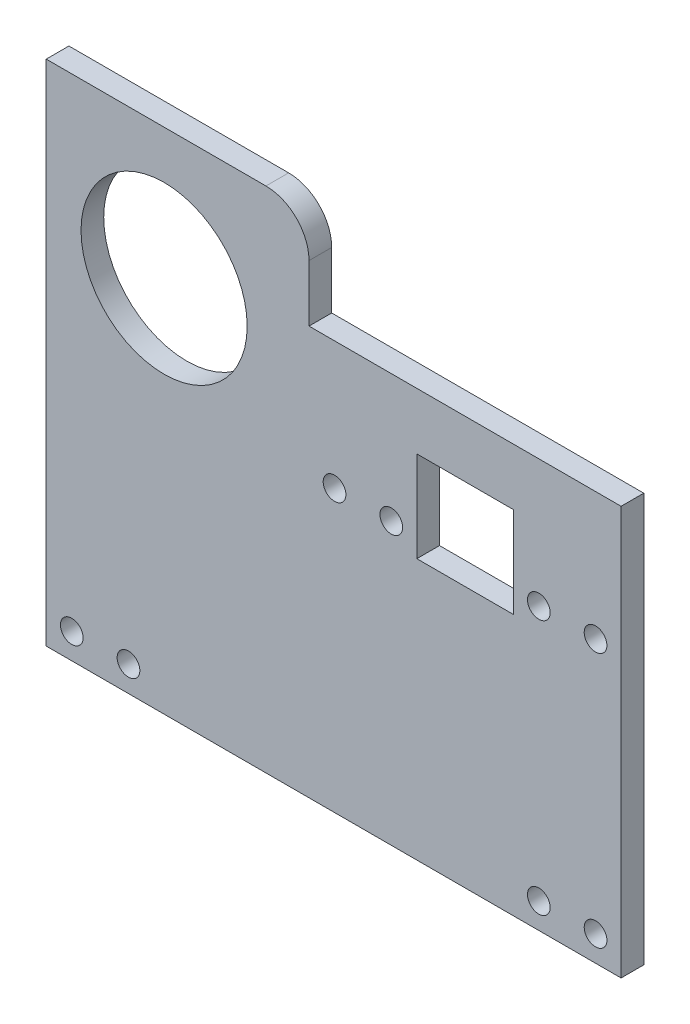
ISO-10303-21;
HEADER;
FILE_DESCRIPTION(('STEP AP214'),'2;1');
FILE_NAME('part.step','',(''),(''),'','','');
FILE_SCHEMA(('AUTOMOTIVE_DESIGN { 1 0 10303 214 1 1 1 1 }'));
ENDSEC;
DATA;
#1=APPLICATION_CONTEXT('core data for automotive mechanical design processes');
#2=APPLICATION_PROTOCOL_DEFINITION('international standard','automotive_design',2000,#1);
#3=PRODUCT_CONTEXT('',#1,'mechanical');
#4=PRODUCT('Part','Part','',(#3));
#5=PRODUCT_RELATED_PRODUCT_CATEGORY('part','',(#4));
#6=PRODUCT_DEFINITION_FORMATION('','',#4);
#7=PRODUCT_DEFINITION_CONTEXT('part definition',#1,'design');
#8=PRODUCT_DEFINITION('design','',#6,#7);
#9=PRODUCT_DEFINITION_SHAPE('','',#8);
#10=(LENGTH_UNIT() NAMED_UNIT(*) SI_UNIT(.MILLI.,.METRE.));
#11=(NAMED_UNIT(*) PLANE_ANGLE_UNIT() SI_UNIT($,.RADIAN.));
#12=(NAMED_UNIT(*) SI_UNIT($,.STERADIAN.) SOLID_ANGLE_UNIT());
#13=UNCERTAINTY_MEASURE_WITH_UNIT(LENGTH_MEASURE(1.E-05),#10,'distance_accuracy_value','');
#14=(GEOMETRIC_REPRESENTATION_CONTEXT(3) GLOBAL_UNCERTAINTY_ASSIGNED_CONTEXT((#13)) GLOBAL_UNIT_ASSIGNED_CONTEXT((#10,
#11,#12)) REPRESENTATION_CONTEXT('',''));
#15=CARTESIAN_POINT('',(0.,0.,0.));
#16=DIRECTION('',(0.,0.,1.));
#17=DIRECTION('',(1.,0.,0.));
#18=AXIS2_PLACEMENT_3D('',#15,#16,#17);
#19=CARTESIAN_POINT('',(-16.5385577934033,-32.1936087650218,4.));
#20=DIRECTION('',(0.,0.,1.));
#21=DIRECTION('',(1.,0.,0.));
#22=AXIS2_PLACEMENT_3D('',#19,#20,#21);
#23=PLANE('',#22);
#24=DIRECTION('',(0.,-1.,0.));
#25=VECTOR('',#24,1.);
#26=CARTESIAN_POINT('',(10.0534872735402,-52.1936087650218,4.));
#27=LINE('',#26,#25);
#28=CARTESIAN_POINT('',(10.0534872735402,-52.1936087650218,4.));
#29=VERTEX_POINT('',#28);
#30=CARTESIAN_POINT('',(10.0534872735403,-68.1936087650218,4.));
#31=VERTEX_POINT('',#30);
#32=EDGE_CURVE('E50',#29,#31,#27,.T.);
#33=ORIENTED_EDGE('',*,*,#32,.F.);
#34=DIRECTION('',(-1.,0.,0.));
#35=VECTOR('',#34,1.);
#36=CARTESIAN_POINT('',(10.0534872735402,-52.1936087650218,4.));
#37=LINE('',#36,#35);
#38=CARTESIAN_POINT('',(27.0534872735403,-52.1936087650218,4.));
#39=VERTEX_POINT('',#38);
#40=EDGE_CURVE('E136',#39,#29,#37,.T.);
#41=ORIENTED_EDGE('',*,*,#40,.F.);
#42=DIRECTION('',(0.,1.,0.));
#43=VECTOR('',#42,1.);
#44=CARTESIAN_POINT('',(27.0534872735403,-52.1936087650218,4.));
#45=LINE('',#44,#43);
#46=CARTESIAN_POINT('',(27.0534872735403,-68.1936087650218,4.));
#47=VERTEX_POINT('',#46);
#48=EDGE_CURVE('E121',#47,#39,#45,.T.);
#49=ORIENTED_EDGE('',*,*,#48,.F.);
#50=DIRECTION('',(1.,0.,0.));
#51=VECTOR('',#50,1.);
#52=CARTESIAN_POINT('',(10.0534872735403,-68.1936087650218,4.));
#53=LINE('',#52,#51);
#54=EDGE_CURVE('E130',#31,#47,#53,.T.);
#55=ORIENTED_EDGE('',*,*,#54,.F.);
#56=EDGE_LOOP('',(#33,#41,#49,#55));
#57=FACE_BOUND('',#56,.T.);
#58=CARTESIAN_POINT('',(31.5534872735402,-109.693608765022,4.));
#59=DIRECTION('',(0.,0.,1.));
#60=DIRECTION('',(1.,0.,0.));
#61=AXIS2_PLACEMENT_3D('',#58,#59,#60);
#62=CIRCLE('',#61,2.);
#63=CARTESIAN_POINT('',(33.5534872735402,-109.693608765022,4.));
#64=VERTEX_POINT('',#63);
#65=EDGE_CURVE('E146',#64,#64,#62,.T.);
#66=ORIENTED_EDGE('',*,*,#65,.F.);
#67=EDGE_LOOP('',(#66));
#68=FACE_BOUND('',#67,.T.);
#69=CARTESIAN_POINT('',(-50.7631628934033,-109.693608765022,4.));
#70=DIRECTION('',(0.,0.,1.));
#71=DIRECTION('',(1.,0.,0.));
#72=AXIS2_PLACEMENT_3D('',#69,#70,#71);
#73=CIRCLE('',#72,2.);
#74=CARTESIAN_POINT('',(-48.7631628934033,-109.693608765022,4.));
#75=VERTEX_POINT('',#74);
#76=EDGE_CURVE('E150',#75,#75,#73,.T.);
#77=ORIENTED_EDGE('',*,*,#76,.F.);
#78=EDGE_LOOP('',(#77));
#79=FACE_BOUND('',#78,.T.);
#80=CARTESIAN_POINT('',(-40.7631628934033,-109.693608765022,4.));
#81=DIRECTION('',(0.,0.,1.));
#82=DIRECTION('',(1.,0.,0.));
#83=AXIS2_PLACEMENT_3D('',#80,#81,#82);
#84=CIRCLE('',#83,2.);
#85=CARTESIAN_POINT('',(-38.7631628934033,-109.693608765022,4.));
#86=VERTEX_POINT('',#85);
#87=EDGE_CURVE('E153',#86,#86,#84,.T.);
#88=ORIENTED_EDGE('',*,*,#87,.F.);
#89=EDGE_LOOP('',(#88));
#90=FACE_BOUND('',#89,.T.);
#91=CARTESIAN_POINT('',(41.5534872735402,-64.6936087650218,4.));
#92=DIRECTION('',(0.,0.,1.));
#93=DIRECTION('',(1.,0.,0.));
#94=AXIS2_PLACEMENT_3D('',#91,#92,#93);
#95=CIRCLE('',#94,2.);
#96=CARTESIAN_POINT('',(43.5534872735402,-64.6936087650218,4.));
#97=VERTEX_POINT('',#96);
#98=EDGE_CURVE('E156',#97,#97,#95,.T.);
#99=ORIENTED_EDGE('',*,*,#98,.F.);
#100=EDGE_LOOP('',(#99));
#101=FACE_BOUND('',#100,.T.);
#102=CARTESIAN_POINT('',(31.5534872735402,-64.6936087650218,4.));
#103=DIRECTION('',(0.,0.,1.));
#104=DIRECTION('',(1.,0.,0.));
#105=AXIS2_PLACEMENT_3D('',#102,#103,#104);
#106=CIRCLE('',#105,2.);
#107=CARTESIAN_POINT('',(33.5534872735402,-64.6936087650218,4.));
#108=VERTEX_POINT('',#107);
#109=EDGE_CURVE('E159',#108,#108,#106,.T.);
#110=ORIENTED_EDGE('',*,*,#109,.F.);
#111=EDGE_LOOP('',(#110));
#112=FACE_BOUND('',#111,.T.);
#113=CARTESIAN_POINT('',(-4.44651272645975,-64.6936087650218,4.));
#114=DIRECTION('',(0.,0.,1.));
#115=DIRECTION('',(1.,0.,0.));
#116=AXIS2_PLACEMENT_3D('',#113,#114,#115);
#117=CIRCLE('',#116,2.);
#118=CARTESIAN_POINT('',(-2.44651272645975,-64.6936087650218,4.));
#119=VERTEX_POINT('',#118);
#120=EDGE_CURVE('E162',#119,#119,#117,.T.);
#121=ORIENTED_EDGE('',*,*,#120,.F.);
#122=EDGE_LOOP('',(#121));
#123=FACE_BOUND('',#122,.T.);
#124=CARTESIAN_POINT('',(5.55348727354025,-64.6936087650218,4.));
#125=DIRECTION('',(0.,0.,1.));
#126=DIRECTION('',(1.,0.,0.));
#127=AXIS2_PLACEMENT_3D('',#124,#125,#126);
#128=CIRCLE('',#127,2.);
#129=CARTESIAN_POINT('',(7.55348727354025,-64.6936087650218,4.));
#130=VERTEX_POINT('',#129);
#131=EDGE_CURVE('E143',#130,#130,#128,.T.);
#132=ORIENTED_EDGE('',*,*,#131,.F.);
#133=EDGE_LOOP('',(#132));
#134=FACE_BOUND('',#133,.T.);
#135=CARTESIAN_POINT('',(41.5534872735402,-109.693608765022,4.));
#136=DIRECTION('',(0.,0.,1.));
#137=DIRECTION('',(1.,0.,0.));
#138=AXIS2_PLACEMENT_3D('',#135,#136,#137);
#139=CIRCLE('',#138,2.);
#140=CARTESIAN_POINT('',(43.5534872735402,-109.693608765022,4.));
#141=VERTEX_POINT('',#140);
#142=EDGE_CURVE('E167',#141,#141,#139,.T.);
#143=ORIENTED_EDGE('',*,*,#142,.F.);
#144=EDGE_LOOP('',(#143));
#145=FACE_BOUND('',#144,.T.);
#146=DIRECTION('',(0.,1.,0.));
#147=VECTOR('',#146,1.);
#148=CARTESIAN_POINT('',(-8.94651272645975,-42.1936087650218,4.));
#149=LINE('',#148,#147);
#150=CARTESIAN_POINT('',(-8.94651272645975,-42.1936087650218,4.));
#151=VERTEX_POINT('',#150);
#152=CARTESIAN_POINT('',(-8.94651272645974,-32.1936087650218,4.));
#153=VERTEX_POINT('',#152);
#154=EDGE_CURVE('E179',#151,#153,#149,.T.);
#155=ORIENTED_EDGE('',*,*,#154,.T.);
#156=CARTESIAN_POINT('',(-16.5385577934033,-32.1936087650218,4.));
#157=DIRECTION('',(0.,0.,1.));
#158=DIRECTION('',(1.,0.,0.));
#159=AXIS2_PLACEMENT_3D('',#156,#157,#158);
#160=CIRCLE('',#159,7.59204506694357);
#161=CARTESIAN_POINT('',(-16.5385577934033,-24.6015636980782,4.));
#162=VERTEX_POINT('',#161);
#163=EDGE_CURVE('E182',#153,#162,#160,.T.);
#164=ORIENTED_EDGE('',*,*,#163,.T.);
#165=DIRECTION('',(-1.,0.,0.));
#166=VECTOR('',#165,1.);
#167=CARTESIAN_POINT('',(-16.5385577934033,-24.6015636980782,4.));
#168=LINE('',#167,#166);
#169=CARTESIAN_POINT('',(-55.2631628934033,-24.6015636980782,4.));
#170=VERTEX_POINT('',#169);
#171=EDGE_CURVE('E185',#162,#170,#168,.T.);
#172=ORIENTED_EDGE('',*,*,#171,.T.);
#173=DIRECTION('',(0.,-1.,0.));
#174=VECTOR('',#173,1.);
#175=CARTESIAN_POINT('',(-55.2631628934033,-24.6015636980782,4.));
#176=LINE('',#175,#174);
#177=CARTESIAN_POINT('',(-55.2631628934033,-114.193608765022,4.));
#178=VERTEX_POINT('',#177);
#179=EDGE_CURVE('E187',#170,#178,#176,.T.);
#180=ORIENTED_EDGE('',*,*,#179,.T.);
#181=DIRECTION('',(1.,0.,0.));
#182=VECTOR('',#181,1.);
#183=CARTESIAN_POINT('',(46.0534872735402,-114.193608765022,4.));
#184=LINE('',#183,#182);
#185=CARTESIAN_POINT('',(46.0534872735402,-114.193608765022,4.));
#186=VERTEX_POINT('',#185);
#187=EDGE_CURVE('E189',#178,#186,#184,.T.);
#188=ORIENTED_EDGE('',*,*,#187,.T.);
#189=DIRECTION('',(0.,1.,0.));
#190=VECTOR('',#189,1.);
#191=CARTESIAN_POINT('',(46.0534872735402,-42.1936087650218,4.));
#192=LINE('',#191,#190);
#193=CARTESIAN_POINT('',(46.0534872735402,-42.1936087650218,4.));
#194=VERTEX_POINT('',#193);
#195=EDGE_CURVE('E191',#186,#194,#192,.T.);
#196=ORIENTED_EDGE('',*,*,#195,.T.);
#197=DIRECTION('',(-1.,0.,0.));
#198=VECTOR('',#197,1.);
#199=CARTESIAN_POINT('',(-8.94651272645975,-42.1936087650218,4.));
#200=LINE('',#199,#198);
#201=EDGE_CURVE('E193',#194,#151,#200,.T.);
#202=ORIENTED_EDGE('',*,*,#201,.T.);
#203=EDGE_LOOP('',(#155,#164,#172,#180,#188,#196,#202));
#204=FACE_BOUND('',#203,.T.);
#205=CARTESIAN_POINT('',(-34.4865127264598,-47.6715636980782,4.));
#206=DIRECTION('',(0.,0.,1.));
#207=DIRECTION('',(1.,0.,0.));
#208=AXIS2_PLACEMENT_3D('',#205,#206,#207);
#209=CIRCLE('',#208,14.6418012005341);
#210=CARTESIAN_POINT('',(-19.8447115259257,-47.6715636980782,4.));
#211=VERTEX_POINT('',#210);
#212=EDGE_CURVE('E172',#211,#211,#209,.T.);
#213=ORIENTED_EDGE('',*,*,#212,.F.);
#214=EDGE_LOOP('',(#213));
#215=FACE_BOUND('',#214,.T.);
#216=ADVANCED_FACE('F35',(#57,#68,#79,#90,#101,#112,#123,#134,#145,#204,#215),#23,.T.);
#217=CARTESIAN_POINT('',(-16.5385577934033,-32.1936087650218,0.));
#218=DIRECTION('',(0.,0.,1.));
#219=DIRECTION('',(1.,0.,0.));
#220=AXIS2_PLACEMENT_3D('',#217,#218,#219);
#221=PLANE('',#220);
#222=DIRECTION('',(-1.,0.,0.));
#223=VECTOR('',#222,1.);
#224=CARTESIAN_POINT('',(-16.5385577934033,-52.1936087650218,0.));
#225=LINE('',#224,#223);
#226=CARTESIAN_POINT('',(27.0534872735403,-52.1936087650218,0.));
#227=VERTEX_POINT('',#226);
#228=CARTESIAN_POINT('',(10.0534872735402,-52.1936087650218,0.));
#229=VERTEX_POINT('',#228);
#230=EDGE_CURVE('E43',#227,#229,#225,.T.);
#231=ORIENTED_EDGE('',*,*,#230,.T.);
#232=DIRECTION('',(0.,-1.,0.));
#233=VECTOR('',#232,1.);
#234=CARTESIAN_POINT('',(10.0534872735402,-32.1936087650218,0.));
#235=LINE('',#234,#233);
#236=CARTESIAN_POINT('',(10.0534872735403,-68.1936087650218,0.));
#237=VERTEX_POINT('',#236);
#238=EDGE_CURVE('E11',#229,#237,#235,.T.);
#239=ORIENTED_EDGE('',*,*,#238,.T.);
#240=DIRECTION('',(1.,0.,0.));
#241=VECTOR('',#240,1.);
#242=CARTESIAN_POINT('',(-16.5385577934033,-68.1936087650218,0.));
#243=LINE('',#242,#241);
#244=CARTESIAN_POINT('',(27.0534872735403,-68.1936087650218,0.));
#245=VERTEX_POINT('',#244);
#246=EDGE_CURVE('E229',#237,#245,#243,.T.);
#247=ORIENTED_EDGE('',*,*,#246,.T.);
#248=DIRECTION('',(0.,1.,0.));
#249=VECTOR('',#248,1.);
#250=CARTESIAN_POINT('',(27.0534872735402,-32.1936087650218,0.));
#251=LINE('',#250,#249);
#252=EDGE_CURVE('E124',#245,#227,#251,.T.);
#253=ORIENTED_EDGE('',*,*,#252,.T.);
#254=EDGE_LOOP('',(#231,#239,#247,#253));
#255=FACE_BOUND('',#254,.T.);
#256=CARTESIAN_POINT('',(31.5534872735402,-109.693608765022,0.));
#257=DIRECTION('',(0.,0.,1.));
#258=DIRECTION('',(1.,0.,0.));
#259=AXIS2_PLACEMENT_3D('',#256,#257,#258);
#260=CIRCLE('',#259,2.);
#261=CARTESIAN_POINT('',(33.5534872735402,-109.693608765022,0.));
#262=VERTEX_POINT('',#261);
#263=EDGE_CURVE('E171',#262,#262,#260,.T.);
#264=ORIENTED_EDGE('',*,*,#263,.T.);
#265=EDGE_LOOP('',(#264));
#266=FACE_BOUND('',#265,.T.);
#267=CARTESIAN_POINT('',(-50.7631628934033,-109.693608765022,0.));
#268=DIRECTION('',(0.,0.,1.));
#269=DIRECTION('',(1.,0.,0.));
#270=AXIS2_PLACEMENT_3D('',#267,#268,#269);
#271=CIRCLE('',#270,2.);
#272=CARTESIAN_POINT('',(-48.7631628934033,-109.693608765022,0.));
#273=VERTEX_POINT('',#272);
#274=EDGE_CURVE('E246',#273,#273,#271,.T.);
#275=ORIENTED_EDGE('',*,*,#274,.T.);
#276=EDGE_LOOP('',(#275));
#277=FACE_BOUND('',#276,.T.);
#278=CARTESIAN_POINT('',(-40.7631628934033,-109.693608765022,0.));
#279=DIRECTION('',(0.,0.,1.));
#280=DIRECTION('',(1.,0.,0.));
#281=AXIS2_PLACEMENT_3D('',#278,#279,#280);
#282=CIRCLE('',#281,2.);
#283=CARTESIAN_POINT('',(-38.7631628934033,-109.693608765022,0.));
#284=VERTEX_POINT('',#283);
#285=EDGE_CURVE('E243',#284,#284,#282,.T.);
#286=ORIENTED_EDGE('',*,*,#285,.T.);
#287=EDGE_LOOP('',(#286));
#288=FACE_BOUND('',#287,.T.);
#289=CARTESIAN_POINT('',(41.5534872735402,-64.6936087650218,0.));
#290=DIRECTION('',(0.,0.,1.));
#291=DIRECTION('',(1.,0.,0.));
#292=AXIS2_PLACEMENT_3D('',#289,#290,#291);
#293=CIRCLE('',#292,2.);
#294=CARTESIAN_POINT('',(43.5534872735402,-64.6936087650218,0.));
#295=VERTEX_POINT('',#294);
#296=EDGE_CURVE('E240',#295,#295,#293,.T.);
#297=ORIENTED_EDGE('',*,*,#296,.T.);
#298=EDGE_LOOP('',(#297));
#299=FACE_BOUND('',#298,.T.);
#300=CARTESIAN_POINT('',(31.5534872735402,-64.6936087650218,0.));
#301=DIRECTION('',(0.,0.,1.));
#302=DIRECTION('',(1.,0.,0.));
#303=AXIS2_PLACEMENT_3D('',#300,#301,#302);
#304=CIRCLE('',#303,2.);
#305=CARTESIAN_POINT('',(33.5534872735402,-64.6936087650218,0.));
#306=VERTEX_POINT('',#305);
#307=EDGE_CURVE('E237',#306,#306,#304,.T.);
#308=ORIENTED_EDGE('',*,*,#307,.T.);
#309=EDGE_LOOP('',(#308));
#310=FACE_BOUND('',#309,.T.);
#311=CARTESIAN_POINT('',(-4.44651272645975,-64.6936087650218,0.));
#312=DIRECTION('',(0.,0.,1.));
#313=DIRECTION('',(1.,0.,0.));
#314=AXIS2_PLACEMENT_3D('',#311,#312,#313);
#315=CIRCLE('',#314,2.);
#316=CARTESIAN_POINT('',(-2.44651272645975,-64.6936087650218,0.));
#317=VERTEX_POINT('',#316);
#318=EDGE_CURVE('E234',#317,#317,#315,.T.);
#319=ORIENTED_EDGE('',*,*,#318,.T.);
#320=EDGE_LOOP('',(#319));
#321=FACE_BOUND('',#320,.T.);
#322=CARTESIAN_POINT('',(5.55348727354025,-64.6936087650218,0.));
#323=DIRECTION('',(0.,0.,1.));
#324=DIRECTION('',(1.,0.,0.));
#325=AXIS2_PLACEMENT_3D('',#322,#323,#324);
#326=CIRCLE('',#325,2.);
#327=CARTESIAN_POINT('',(7.55348727354025,-64.6936087650218,0.));
#328=VERTEX_POINT('',#327);
#329=EDGE_CURVE('E149',#328,#328,#326,.T.);
#330=ORIENTED_EDGE('',*,*,#329,.T.);
#331=EDGE_LOOP('',(#330));
#332=FACE_BOUND('',#331,.T.);
#333=CARTESIAN_POINT('',(41.5534872735402,-109.693608765022,0.));
#334=DIRECTION('',(0.,0.,1.));
#335=DIRECTION('',(1.,0.,0.));
#336=AXIS2_PLACEMENT_3D('',#333,#334,#335);
#337=CIRCLE('',#336,2.);
#338=CARTESIAN_POINT('',(43.5534872735402,-109.693608765022,0.));
#339=VERTEX_POINT('',#338);
#340=EDGE_CURVE('E170',#339,#339,#337,.T.);
#341=ORIENTED_EDGE('',*,*,#340,.T.);
#342=EDGE_LOOP('',(#341));
#343=FACE_BOUND('',#342,.T.);
#344=DIRECTION('',(0.,1.,0.));
#345=VECTOR('',#344,1.);
#346=CARTESIAN_POINT('',(-8.94651272645975,-42.1936087650218,0.));
#347=LINE('',#346,#345);
#348=CARTESIAN_POINT('',(-8.94651272645975,-42.1936087650218,0.));
#349=VERTEX_POINT('',#348);
#350=CARTESIAN_POINT('',(-8.94651272645974,-32.1936087650218,0.));
#351=VERTEX_POINT('',#350);
#352=EDGE_CURVE('E175',#349,#351,#347,.T.);
#353=ORIENTED_EDGE('',*,*,#352,.F.);
#354=DIRECTION('',(-1.,0.,0.));
#355=VECTOR('',#354,1.);
#356=CARTESIAN_POINT('',(-8.94651272645975,-42.1936087650218,0.));
#357=LINE('',#356,#355);
#358=CARTESIAN_POINT('',(46.0534872735402,-42.1936087650218,0.));
#359=VERTEX_POINT('',#358);
#360=EDGE_CURVE('E183',#359,#349,#357,.T.);
#361=ORIENTED_EDGE('',*,*,#360,.F.);
#362=DIRECTION('',(0.,1.,0.));
#363=VECTOR('',#362,1.);
#364=CARTESIAN_POINT('',(46.0534872735402,-42.1936087650218,0.));
#365=LINE('',#364,#363);
#366=CARTESIAN_POINT('',(46.0534872735402,-114.193608765022,0.));
#367=VERTEX_POINT('',#366);
#368=EDGE_CURVE('E206',#367,#359,#365,.T.);
#369=ORIENTED_EDGE('',*,*,#368,.F.);
#370=DIRECTION('',(1.,0.,0.));
#371=VECTOR('',#370,1.);
#372=CARTESIAN_POINT('',(46.0534872735402,-114.193608765022,0.));
#373=LINE('',#372,#371);
#374=CARTESIAN_POINT('',(-55.2631628934033,-114.193608765022,0.));
#375=VERTEX_POINT('',#374);
#376=EDGE_CURVE('E204',#375,#367,#373,.T.);
#377=ORIENTED_EDGE('',*,*,#376,.F.);
#378=DIRECTION('',(0.,-1.,0.));
#379=VECTOR('',#378,1.);
#380=CARTESIAN_POINT('',(-55.2631628934033,-24.6015636980782,0.));
#381=LINE('',#380,#379);
#382=CARTESIAN_POINT('',(-55.2631628934033,-24.6015636980782,0.));
#383=VERTEX_POINT('',#382);
#384=EDGE_CURVE('E202',#383,#375,#381,.T.);
#385=ORIENTED_EDGE('',*,*,#384,.F.);
#386=DIRECTION('',(-1.,0.,0.));
#387=VECTOR('',#386,1.);
#388=CARTESIAN_POINT('',(-16.5385577934033,-24.6015636980782,0.));
#389=LINE('',#388,#387);
#390=CARTESIAN_POINT('',(-16.5385577934033,-24.6015636980782,0.));
#391=VERTEX_POINT('',#390);
#392=EDGE_CURVE('E200',#391,#383,#389,.T.);
#393=ORIENTED_EDGE('',*,*,#392,.F.);
#394=CARTESIAN_POINT('',(-16.5385577934033,-32.1936087650218,0.));
#395=DIRECTION('',(0.,0.,1.));
#396=DIRECTION('',(1.,0.,0.));
#397=AXIS2_PLACEMENT_3D('',#394,#395,#396);
#398=CIRCLE('',#397,7.59204506694357);
#399=EDGE_CURVE('E198',#351,#391,#398,.T.);
#400=ORIENTED_EDGE('',*,*,#399,.F.);
#401=EDGE_LOOP('',(#353,#361,#369,#377,#385,#393,#400));
#402=FACE_BOUND('',#401,.T.);
#403=CARTESIAN_POINT('',(-34.4865127264598,-47.6715636980782,0.));
#404=DIRECTION('',(0.,0.,1.));
#405=DIRECTION('',(1.,0.,0.));
#406=AXIS2_PLACEMENT_3D('',#403,#404,#405);
#407=CIRCLE('',#406,14.6418012005341);
#408=CARTESIAN_POINT('',(-19.8447115259257,-47.6715636980782,0.));
#409=VERTEX_POINT('',#408);
#410=EDGE_CURVE('E176',#409,#409,#407,.T.);
#411=ORIENTED_EDGE('',*,*,#410,.T.);
#412=EDGE_LOOP('',(#411));
#413=FACE_BOUND('',#412,.T.);
#414=ADVANCED_FACE('F254',(#255,#266,#277,#288,#299,#310,#321,#332,#343,#402,#413),#221,.F.);
#415=CARTESIAN_POINT('',(-8.94651272645975,-42.1936087650218,4.));
#416=DIRECTION('',(-1.,0.,0.));
#417=DIRECTION('',(0.,-1.,0.));
#418=AXIS2_PLACEMENT_3D('',#415,#416,#417);
#419=PLANE('',#418);
#420=ORIENTED_EDGE('',*,*,#352,.T.);
#421=DIRECTION('',(0.,0.,-1.));
#422=VECTOR('',#421,1.);
#423=CARTESIAN_POINT('',(-8.94651272645974,-32.1936087650218,4.));
#424=LINE('',#423,#422);
#425=EDGE_CURVE('E226',#153,#351,#424,.T.);
#426=ORIENTED_EDGE('',*,*,#425,.F.);
#427=ORIENTED_EDGE('',*,*,#154,.F.);
#428=DIRECTION('',(0.,0.,-1.));
#429=VECTOR('',#428,1.);
#430=CARTESIAN_POINT('',(-8.94651272645975,-42.1936087650218,4.));
#431=LINE('',#430,#429);
#432=EDGE_CURVE('E195',#151,#349,#431,.T.);
#433=ORIENTED_EDGE('',*,*,#432,.T.);
#434=EDGE_LOOP('',(#420,#426,#427,#433));
#435=FACE_BOUND('',#434,.T.);
#436=ADVANCED_FACE('F37',(#435),#419,.F.);
#437=CARTESIAN_POINT('',(-16.5385577934033,-32.1936087650218,4.));
#438=DIRECTION('',(0.,0.,-1.));
#439=DIRECTION('',(-1.,0.,0.));
#440=AXIS2_PLACEMENT_3D('',#437,#438,#439);
#441=CYLINDRICAL_SURFACE('',#440,7.59204506694357);
#442=ORIENTED_EDGE('',*,*,#399,.T.);
#443=DIRECTION('',(0.,0.,-1.));
#444=VECTOR('',#443,1.);
#445=CARTESIAN_POINT('',(-16.5385577934033,-24.6015636980782,4.));
#446=LINE('',#445,#444);
#447=EDGE_CURVE('E223',#162,#391,#446,.T.);
#448=ORIENTED_EDGE('',*,*,#447,.F.);
#449=ORIENTED_EDGE('',*,*,#163,.F.);
#450=ORIENTED_EDGE('',*,*,#425,.T.);
#451=EDGE_LOOP('',(#442,#448,#449,#450));
#452=FACE_BOUND('',#451,.T.);
#453=ADVANCED_FACE('F300',(#452),#441,.T.);
#454=CARTESIAN_POINT('',(-16.5385577934033,-24.6015636980782,4.));
#455=DIRECTION('',(0.,-1.,0.));
#456=DIRECTION('',(0.,0.,-1.));
#457=AXIS2_PLACEMENT_3D('',#454,#455,#456);
#458=PLANE('',#457);
#459=ORIENTED_EDGE('',*,*,#392,.T.);
#460=DIRECTION('',(0.,0.,-1.));
#461=VECTOR('',#460,1.);
#462=CARTESIAN_POINT('',(-55.2631628934033,-24.6015636980782,4.));
#463=LINE('',#462,#461);
#464=EDGE_CURVE('E220',#170,#383,#463,.T.);
#465=ORIENTED_EDGE('',*,*,#464,.F.);
#466=ORIENTED_EDGE('',*,*,#171,.F.);
#467=ORIENTED_EDGE('',*,*,#447,.T.);
#468=EDGE_LOOP('',(#459,#465,#466,#467));
#469=FACE_BOUND('',#468,.T.);
#470=ADVANCED_FACE('F297',(#469),#458,.F.);
#471=CARTESIAN_POINT('',(-55.2631628934033,-24.6015636980782,4.));
#472=DIRECTION('',(1.,0.,0.));
#473=DIRECTION('',(0.,1.,0.));
#474=AXIS2_PLACEMENT_3D('',#471,#472,#473);
#475=PLANE('',#474);
#476=ORIENTED_EDGE('',*,*,#384,.T.);
#477=DIRECTION('',(0.,0.,-1.));
#478=VECTOR('',#477,1.);
#479=CARTESIAN_POINT('',(-55.2631628934033,-114.193608765022,4.));
#480=LINE('',#479,#478);
#481=EDGE_CURVE('E217',#178,#375,#480,.T.);
#482=ORIENTED_EDGE('',*,*,#481,.F.);
#483=ORIENTED_EDGE('',*,*,#179,.F.);
#484=ORIENTED_EDGE('',*,*,#464,.T.);
#485=EDGE_LOOP('',(#476,#482,#483,#484));
#486=FACE_BOUND('',#485,.T.);
#487=ADVANCED_FACE('F293',(#486),#475,.F.);
#488=CARTESIAN_POINT('',(46.0534872735402,-114.193608765022,4.));
#489=DIRECTION('',(0.,1.,0.));
#490=DIRECTION('',(0.,0.,1.));
#491=AXIS2_PLACEMENT_3D('',#488,#489,#490);
#492=PLANE('',#491);
#493=ORIENTED_EDGE('',*,*,#376,.T.);
#494=DIRECTION('',(0.,0.,-1.));
#495=VECTOR('',#494,1.);
#496=CARTESIAN_POINT('',(46.0534872735402,-114.193608765022,4.));
#497=LINE('',#496,#495);
#498=EDGE_CURVE('E214',#186,#367,#497,.T.);
#499=ORIENTED_EDGE('',*,*,#498,.F.);
#500=ORIENTED_EDGE('',*,*,#187,.F.);
#501=ORIENTED_EDGE('',*,*,#481,.T.);
#502=EDGE_LOOP('',(#493,#499,#500,#501));
#503=FACE_BOUND('',#502,.T.);
#504=ADVANCED_FACE('F289',(#503),#492,.F.);
#505=CARTESIAN_POINT('',(46.0534872735402,-42.1936087650218,4.));
#506=DIRECTION('',(-1.,0.,0.));
#507=DIRECTION('',(0.,0.,1.));
#508=AXIS2_PLACEMENT_3D('',#505,#506,#507);
#509=PLANE('',#508);
#510=ORIENTED_EDGE('',*,*,#368,.T.);
#511=DIRECTION('',(0.,0.,-1.));
#512=VECTOR('',#511,1.);
#513=CARTESIAN_POINT('',(46.0534872735402,-42.1936087650218,4.));
#514=LINE('',#513,#512);
#515=EDGE_CURVE('E211',#194,#359,#514,.T.);
#516=ORIENTED_EDGE('',*,*,#515,.F.);
#517=ORIENTED_EDGE('',*,*,#195,.F.);
#518=ORIENTED_EDGE('',*,*,#498,.T.);
#519=EDGE_LOOP('',(#510,#516,#517,#518));
#520=FACE_BOUND('',#519,.T.);
#521=ADVANCED_FACE('F285',(#520),#509,.F.);
#522=CARTESIAN_POINT('',(-8.94651272645975,-42.1936087650218,4.));
#523=DIRECTION('',(0.,-1.,0.));
#524=DIRECTION('',(1.,0.,0.));
#525=AXIS2_PLACEMENT_3D('',#522,#523,#524);
#526=PLANE('',#525);
#527=ORIENTED_EDGE('',*,*,#360,.T.);
#528=ORIENTED_EDGE('',*,*,#432,.F.);
#529=ORIENTED_EDGE('',*,*,#201,.F.);
#530=ORIENTED_EDGE('',*,*,#515,.T.);
#531=EDGE_LOOP('',(#527,#528,#529,#530));
#532=FACE_BOUND('',#531,.T.);
#533=ADVANCED_FACE('F282',(#532),#526,.F.);
#534=CARTESIAN_POINT('',(-34.4865127264598,-47.6715636980782,4.));
#535=DIRECTION('',(0.,0.,-1.));
#536=DIRECTION('',(-1.,0.,0.));
#537=AXIS2_PLACEMENT_3D('',#534,#535,#536);
#538=CYLINDRICAL_SURFACE('',#537,14.6418012005341);
#539=ORIENTED_EDGE('',*,*,#212,.T.);
#540=EDGE_LOOP('',(#539));
#541=FACE_BOUND('',#540,.T.);
#542=ORIENTED_EDGE('',*,*,#410,.F.);
#543=EDGE_LOOP('',(#542));
#544=FACE_BOUND('',#543,.T.);
#545=ADVANCED_FACE('F279',(#541,#544),#538,.F.);
#546=CARTESIAN_POINT('',(41.5534872735402,-109.693608765022,-12.));
#547=DIRECTION('',(0.,0.,1.));
#548=DIRECTION('',(1.,0.,0.));
#549=AXIS2_PLACEMENT_3D('',#546,#547,#548);
#550=CYLINDRICAL_SURFACE('',#549,2.);
#551=ORIENTED_EDGE('',*,*,#142,.T.);
#552=EDGE_LOOP('',(#551));
#553=FACE_BOUND('',#552,.T.);
#554=ORIENTED_EDGE('',*,*,#340,.F.);
#555=EDGE_LOOP('',(#554));
#556=FACE_BOUND('',#555,.T.);
#557=ADVANCED_FACE('F335',(#553,#556),#550,.F.);
#558=CARTESIAN_POINT('',(5.55348727354025,-64.6936087650218,-12.));
#559=DIRECTION('',(0.,0.,1.));
#560=DIRECTION('',(1.,0.,0.));
#561=AXIS2_PLACEMENT_3D('',#558,#559,#560);
#562=CYLINDRICAL_SURFACE('',#561,2.);
#563=ORIENTED_EDGE('',*,*,#131,.T.);
#564=EDGE_LOOP('',(#563));
#565=FACE_BOUND('',#564,.T.);
#566=ORIENTED_EDGE('',*,*,#329,.F.);
#567=EDGE_LOOP('',(#566));
#568=FACE_BOUND('',#567,.T.);
#569=ADVANCED_FACE('F340',(#565,#568),#562,.F.);
#570=CARTESIAN_POINT('',(-4.44651272645975,-64.6936087650218,-12.));
#571=DIRECTION('',(0.,0.,1.));
#572=DIRECTION('',(1.,0.,0.));
#573=AXIS2_PLACEMENT_3D('',#570,#571,#572);
#574=CYLINDRICAL_SURFACE('',#573,2.);
#575=ORIENTED_EDGE('',*,*,#120,.T.);
#576=EDGE_LOOP('',(#575));
#577=FACE_BOUND('',#576,.T.);
#578=ORIENTED_EDGE('',*,*,#318,.F.);
#579=EDGE_LOOP('',(#578));
#580=FACE_BOUND('',#579,.T.);
#581=ADVANCED_FACE('F345',(#577,#580),#574,.F.);
#582=CARTESIAN_POINT('',(31.5534872735402,-64.6936087650218,-12.));
#583=DIRECTION('',(0.,0.,1.));
#584=DIRECTION('',(1.,0.,0.));
#585=AXIS2_PLACEMENT_3D('',#582,#583,#584);
#586=CYLINDRICAL_SURFACE('',#585,2.);
#587=ORIENTED_EDGE('',*,*,#109,.T.);
#588=EDGE_LOOP('',(#587));
#589=FACE_BOUND('',#588,.T.);
#590=ORIENTED_EDGE('',*,*,#307,.F.);
#591=EDGE_LOOP('',(#590));
#592=FACE_BOUND('',#591,.T.);
#593=ADVANCED_FACE('F352',(#589,#592),#586,.F.);
#594=CARTESIAN_POINT('',(41.5534872735402,-64.6936087650218,-12.));
#595=DIRECTION('',(0.,0.,1.));
#596=DIRECTION('',(1.,0.,0.));
#597=AXIS2_PLACEMENT_3D('',#594,#595,#596);
#598=CYLINDRICAL_SURFACE('',#597,2.);
#599=ORIENTED_EDGE('',*,*,#98,.T.);
#600=EDGE_LOOP('',(#599));
#601=FACE_BOUND('',#600,.T.);
#602=ORIENTED_EDGE('',*,*,#296,.F.);
#603=EDGE_LOOP('',(#602));
#604=FACE_BOUND('',#603,.T.);
#605=ADVANCED_FACE('F356',(#601,#604),#598,.F.);
#606=CARTESIAN_POINT('',(-40.7631628934033,-109.693608765022,-12.));
#607=DIRECTION('',(0.,0.,1.));
#608=DIRECTION('',(1.,0.,0.));
#609=AXIS2_PLACEMENT_3D('',#606,#607,#608);
#610=CYLINDRICAL_SURFACE('',#609,2.);
#611=ORIENTED_EDGE('',*,*,#87,.T.);
#612=EDGE_LOOP('',(#611));
#613=FACE_BOUND('',#612,.T.);
#614=ORIENTED_EDGE('',*,*,#285,.F.);
#615=EDGE_LOOP('',(#614));
#616=FACE_BOUND('',#615,.T.);
#617=ADVANCED_FACE('F360',(#613,#616),#610,.F.);
#618=CARTESIAN_POINT('',(-50.7631628934033,-109.693608765022,-12.));
#619=DIRECTION('',(0.,0.,1.));
#620=DIRECTION('',(1.,0.,0.));
#621=AXIS2_PLACEMENT_3D('',#618,#619,#620);
#622=CYLINDRICAL_SURFACE('',#621,2.);
#623=ORIENTED_EDGE('',*,*,#76,.T.);
#624=EDGE_LOOP('',(#623));
#625=FACE_BOUND('',#624,.T.);
#626=ORIENTED_EDGE('',*,*,#274,.F.);
#627=EDGE_LOOP('',(#626));
#628=FACE_BOUND('',#627,.T.);
#629=ADVANCED_FACE('F268',(#625,#628),#622,.F.);
#630=CARTESIAN_POINT('',(31.5534872735402,-109.693608765022,-12.));
#631=DIRECTION('',(0.,0.,1.));
#632=DIRECTION('',(1.,0.,0.));
#633=AXIS2_PLACEMENT_3D('',#630,#631,#632);
#634=CYLINDRICAL_SURFACE('',#633,2.);
#635=ORIENTED_EDGE('',*,*,#65,.T.);
#636=EDGE_LOOP('',(#635));
#637=FACE_BOUND('',#636,.T.);
#638=ORIENTED_EDGE('',*,*,#263,.F.);
#639=EDGE_LOOP('',(#638));
#640=FACE_BOUND('',#639,.T.);
#641=ADVANCED_FACE('F261',(#637,#640),#634,.F.);
#642=CARTESIAN_POINT('',(10.0534872735402,-52.1936087650218,-3.));
#643=DIRECTION('',(-1.,0.,0.));
#644=DIRECTION('',(0.,-1.,0.));
#645=AXIS2_PLACEMENT_3D('',#642,#643,#644);
#646=PLANE('',#645);
#647=DIRECTION('',(0.,0.,1.));
#648=VECTOR('',#647,1.);
#649=CARTESIAN_POINT('',(10.0534872735402,-52.1936087650218,-3.));
#650=LINE('',#649,#648);
#651=EDGE_CURVE('E141',#229,#29,#650,.T.);
#652=ORIENTED_EDGE('',*,*,#651,.T.);
#653=ORIENTED_EDGE('',*,*,#32,.T.);
#654=DIRECTION('',(0.,0.,1.));
#655=VECTOR('',#654,1.);
#656=CARTESIAN_POINT('',(10.0534872735403,-68.1936087650218,-3.));
#657=LINE('',#656,#655);
#658=EDGE_CURVE('E127',#237,#31,#657,.T.);
#659=ORIENTED_EDGE('',*,*,#658,.F.);
#660=ORIENTED_EDGE('',*,*,#238,.F.);
#661=EDGE_LOOP('',(#652,#653,#659,#660));
#662=FACE_BOUND('',#661,.T.);
#663=ADVANCED_FACE('F259',(#662),#646,.F.);
#664=CARTESIAN_POINT('',(10.0534872735402,-52.1936087650218,-3.));
#665=DIRECTION('',(0.,1.,0.));
#666=DIRECTION('',(0.,0.,1.));
#667=AXIS2_PLACEMENT_3D('',#664,#665,#666);
#668=PLANE('',#667);
#669=DIRECTION('',(0.,0.,1.));
#670=VECTOR('',#669,1.);
#671=CARTESIAN_POINT('',(27.0534872735403,-52.1936087650218,-3.));
#672=LINE('',#671,#670);
#673=EDGE_CURVE('E126',#227,#39,#672,.T.);
#674=ORIENTED_EDGE('',*,*,#673,.T.);
#675=ORIENTED_EDGE('',*,*,#40,.T.);
#676=ORIENTED_EDGE('',*,*,#651,.F.);
#677=ORIENTED_EDGE('',*,*,#230,.F.);
#678=EDGE_LOOP('',(#674,#675,#676,#677));
#679=FACE_BOUND('',#678,.T.);
#680=ADVANCED_FACE('F258',(#679),#668,.F.);
#681=CARTESIAN_POINT('',(27.0534872735403,-52.1936087650218,-3.));
#682=DIRECTION('',(1.,0.,0.));
#683=DIRECTION('',(0.,1.,0.));
#684=AXIS2_PLACEMENT_3D('',#681,#682,#683);
#685=PLANE('',#684);
#686=DIRECTION('',(0.,0.,1.));
#687=VECTOR('',#686,1.);
#688=CARTESIAN_POINT('',(27.0534872735403,-68.1936087650218,-3.));
#689=LINE('',#688,#687);
#690=EDGE_CURVE('E58',#245,#47,#689,.T.);
#691=ORIENTED_EDGE('',*,*,#690,.T.);
#692=ORIENTED_EDGE('',*,*,#48,.T.);
#693=ORIENTED_EDGE('',*,*,#673,.F.);
#694=ORIENTED_EDGE('',*,*,#252,.F.);
#695=EDGE_LOOP('',(#691,#692,#693,#694));
#696=FACE_BOUND('',#695,.T.);
#697=ADVANCED_FACE('F118',(#696),#685,.F.);
#698=CARTESIAN_POINT('',(10.0534872735403,-68.1936087650218,-3.));
#699=DIRECTION('',(0.,-1.,0.));
#700=DIRECTION('',(0.,0.,-1.));
#701=AXIS2_PLACEMENT_3D('',#698,#699,#700);
#702=PLANE('',#701);
#703=ORIENTED_EDGE('',*,*,#658,.T.);
#704=ORIENTED_EDGE('',*,*,#54,.T.);
#705=ORIENTED_EDGE('',*,*,#690,.F.);
#706=ORIENTED_EDGE('',*,*,#246,.F.);
#707=EDGE_LOOP('',(#703,#704,#705,#706));
#708=FACE_BOUND('',#707,.T.);
#709=ADVANCED_FACE('F131',(#708),#702,.F.);
#710=CLOSED_SHELL('',(#216,#414,#436,#453,#470,#487,#504,#521,#533,#545,#557,#569,#581,#593,
#605,#617,#629,#641,#663,#680,#697,#709));
#711=MANIFOLD_SOLID_BREP('B2',#710);
#712=ADVANCED_BREP_SHAPE_REPRESENTATION('',(#18,#711),#14);
#713=SHAPE_DEFINITION_REPRESENTATION(#9,#712);
ENDSEC;
END-ISO-10303-21;
